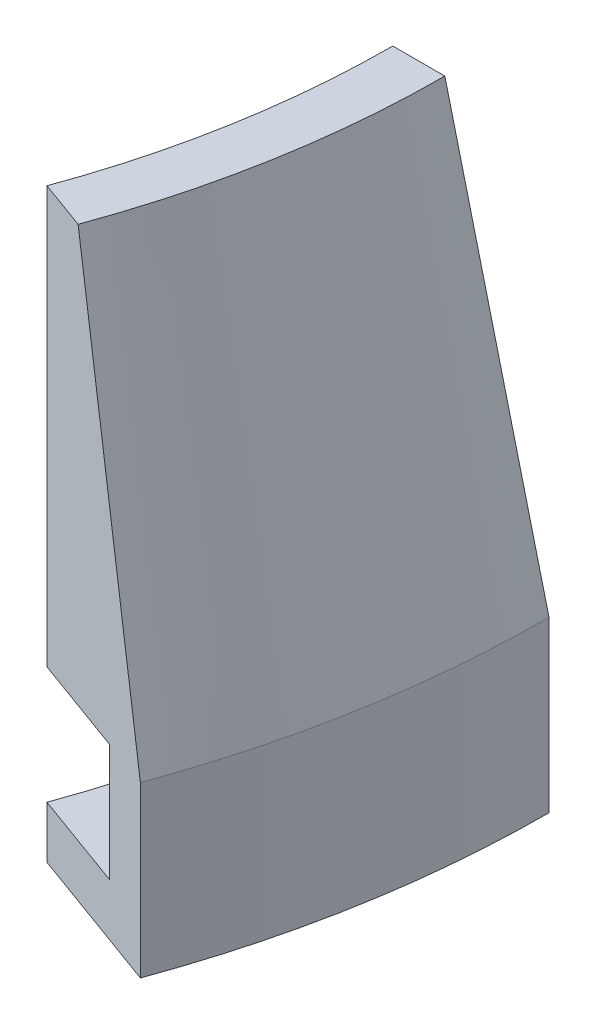
ISO-10303-21;
HEADER;
FILE_DESCRIPTION(('STEP AP214'),'2;1');
FILE_NAME('part.step','',(''),(''),'','','');
FILE_SCHEMA(('AUTOMOTIVE_DESIGN { 1 0 10303 214 1 1 1 1 }'));
ENDSEC;
DATA;
#1=APPLICATION_CONTEXT('core data for automotive mechanical design processes');
#2=APPLICATION_PROTOCOL_DEFINITION('international standard','automotive_design',2000,#1);
#3=PRODUCT_CONTEXT('',#1,'mechanical');
#4=PRODUCT('Part','Part','',(#3));
#5=PRODUCT_RELATED_PRODUCT_CATEGORY('part','',(#4));
#6=PRODUCT_DEFINITION_FORMATION('','',#4);
#7=PRODUCT_DEFINITION_CONTEXT('part definition',#1,'design');
#8=PRODUCT_DEFINITION('design','',#6,#7);
#9=PRODUCT_DEFINITION_SHAPE('','',#8);
#10=(LENGTH_UNIT() NAMED_UNIT(*) SI_UNIT(.MILLI.,.METRE.));
#11=(NAMED_UNIT(*) PLANE_ANGLE_UNIT() SI_UNIT($,.RADIAN.));
#12=(NAMED_UNIT(*) SI_UNIT($,.STERADIAN.) SOLID_ANGLE_UNIT());
#13=UNCERTAINTY_MEASURE_WITH_UNIT(LENGTH_MEASURE(1.E-05),#10,'distance_accuracy_value','');
#14=(GEOMETRIC_REPRESENTATION_CONTEXT(3) GLOBAL_UNCERTAINTY_ASSIGNED_CONTEXT((#13)) GLOBAL_UNIT_ASSIGNED_CONTEXT((#10,
#11,#12)) REPRESENTATION_CONTEXT('',''));
#15=CARTESIAN_POINT('',(0.,0.,0.));
#16=DIRECTION('',(0.,0.,1.));
#17=DIRECTION('',(1.,0.,0.));
#18=AXIS2_PLACEMENT_3D('',#15,#16,#17);
#19=CARTESIAN_POINT('',(-104.775,0.,0.));
#20=DIRECTION('',(0.,-1.,0.));
#21=DIRECTION('',(1.,0.,0.));
#22=AXIS2_PLACEMENT_3D('',#19,#20,#21);
#23=CONICAL_SURFACE('',#22,123.825,0.244978663126864);
#24=CARTESIAN_POINT('',(-104.775,50.7999999999999,0.));
#25=DIRECTION('',(0.,1.,0.));
#26=DIRECTION('',(-1.,0.,0.));
#27=AXIS2_PLACEMENT_3D('',#24,#25,#26);
#28=CIRCLE('',#27,111.125);
#29=CARTESIAN_POINT('',(-0.351657515165962,50.8,38.006988427065));
#30=VERTEX_POINT('',#29);
#31=CARTESIAN_POINT('',(6.35,50.8,0.));
#32=VERTEX_POINT('',#31);
#33=EDGE_CURVE('E11',#30,#32,#28,.T.);
#34=ORIENTED_EDGE('',*,*,#33,.F.);
#35=DIRECTION('',(-0.22790893712434,0.970142500145332,-0.0829520692365073));
#36=VECTOR('',#35,1.);
#37=CARTESIAN_POINT('',(10.5294302731697,4.48235294117647,41.9673804984567));
#38=LINE('',#37,#36);
#39=CARTESIAN_POINT('',(11.5824387688151,0.,42.350644247301));
#40=VERTEX_POINT('',#39);
#41=EDGE_CURVE('E157',#40,#30,#38,.T.);
#42=ORIENTED_EDGE('',*,*,#41,.F.);
#43=CARTESIAN_POINT('',(-104.775,0.,0.));
#44=DIRECTION('',(0.,1.,0.));
#45=DIRECTION('',(-1.,0.,0.));
#46=AXIS2_PLACEMENT_3D('',#43,#44,#45);
#47=CIRCLE('',#46,123.825);
#48=CARTESIAN_POINT('',(19.05,0.,0.));
#49=VERTEX_POINT('',#48);
#50=EDGE_CURVE('E55',#40,#49,#47,.T.);
#51=ORIENTED_EDGE('',*,*,#50,.T.);
#52=DIRECTION('',(-0.242535625036333,0.970142500145332,0.));
#53=VECTOR('',#52,1.);
#54=CARTESIAN_POINT('',(17.9294117647059,4.48235294117647,0.));
#55=LINE('',#54,#53);
#56=EDGE_CURVE('E121',#49,#32,#55,.T.);
#57=ORIENTED_EDGE('',*,*,#56,.T.);
#58=EDGE_LOOP('',(#34,#42,#51,#57));
#59=FACE_BOUND('',#58,.T.);
#60=ADVANCED_FACE('F39',(#59),#23,.T.);
#61=CARTESIAN_POINT('',(-6.31870565715643,50.8,35.835160516947));
#62=DIRECTION('',(0.,-1.,0.));
#63=DIRECTION('',(1.,0.,0.));
#64=AXIS2_PLACEMENT_3D('',#61,#62,#63);
#65=PLANE('',#64);
#66=CARTESIAN_POINT('',(-104.775,50.8,0.));
#67=DIRECTION('',(0.,1.,0.));
#68=DIRECTION('',(-1.,0.,0.));
#69=AXIS2_PLACEMENT_3D('',#66,#67,#68);
#70=CIRCLE('',#69,104.775);
#71=CARTESIAN_POINT('',(-6.31870565715648,50.8,35.835160516947));
#72=VERTEX_POINT('',#71);
#73=CARTESIAN_POINT('',(0.,50.8,0.));
#74=VERTEX_POINT('',#73);
#75=EDGE_CURVE('E48',#72,#74,#70,.T.);
#76=ORIENTED_EDGE('',*,*,#75,.F.);
#77=DIRECTION('',(-0.939692620785908,0.,-0.342020143325669));
#78=VECTOR('',#77,1.);
#79=CARTESIAN_POINT('',(-6.31870565715643,50.8,35.835160516947));
#80=LINE('',#79,#78);
#81=EDGE_CURVE('E117',#30,#72,#80,.T.);
#82=ORIENTED_EDGE('',*,*,#81,.F.);
#83=ORIENTED_EDGE('',*,*,#33,.T.);
#84=DIRECTION('',(-1.,0.,0.));
#85=VECTOR('',#84,1.);
#86=CARTESIAN_POINT('',(0.,50.8,0.));
#87=LINE('',#86,#85);
#88=EDGE_CURVE('E114',#32,#74,#87,.T.);
#89=ORIENTED_EDGE('',*,*,#88,.T.);
#90=EDGE_LOOP('',(#76,#82,#83,#89));
#91=FACE_BOUND('',#90,.T.);
#92=ADVANCED_FACE('F41',(#91),#65,.F.);
#93=CARTESIAN_POINT('',(-104.775,37.305468679812,0.));
#94=DIRECTION('',(0.,1.,0.));
#95=DIRECTION('',(-1.,0.,0.));
#96=AXIS2_PLACEMENT_3D('',#93,#94,#95);
#97=CYLINDRICAL_SURFACE('',#96,104.775);
#98=CARTESIAN_POINT('',(-104.775,0.,0.));
#99=DIRECTION('',(0.,1.,0.));
#100=DIRECTION('',(-1.,0.,0.));
#101=AXIS2_PLACEMENT_3D('',#98,#99,#100);
#102=CIRCLE('',#101,104.775);
#103=CARTESIAN_POINT('',(-6.31870565715648,0.,35.835160516947));
#104=VERTEX_POINT('',#103);
#105=CARTESIAN_POINT('',(0.,0.,0.));
#106=VERTEX_POINT('',#105);
#107=EDGE_CURVE('E205',#104,#106,#102,.T.);
#108=ORIENTED_EDGE('',*,*,#107,.F.);
#109=DIRECTION('',(0.,1.,0.));
#110=VECTOR('',#109,1.);
#111=CARTESIAN_POINT('',(-6.31870565715648,0.,35.835160516947));
#112=LINE('',#111,#110);
#113=EDGE_CURVE('E162',#104,#72,#112,.T.);
#114=ORIENTED_EDGE('',*,*,#113,.T.);
#115=ORIENTED_EDGE('',*,*,#75,.T.);
#116=DIRECTION('',(0.,1.,0.));
#117=VECTOR('',#116,1.);
#118=CARTESIAN_POINT('',(0.,0.,0.));
#119=LINE('',#118,#117);
#120=EDGE_CURVE('E129',#106,#74,#119,.T.);
#121=ORIENTED_EDGE('',*,*,#120,.F.);
#122=EDGE_LOOP('',(#108,#114,#115,#121));
#123=FACE_BOUND('',#122,.T.);
#124=ADVANCED_FACE('F209',(#123),#97,.F.);
#125=CARTESIAN_POINT('',(-6.31870565715648,0.,35.835160516947));
#126=DIRECTION('',(0.,1.,0.));
#127=DIRECTION('',(-1.,0.,0.));
#128=AXIS2_PLACEMENT_3D('',#125,#126,#127);
#129=PLANE('',#128);
#130=CARTESIAN_POINT('',(-104.775,0.,0.));
#131=DIRECTION('',(0.,1.,0.));
#132=DIRECTION('',(-1.,0.,0.));
#133=AXIS2_PLACEMENT_3D('',#130,#131,#132);
#134=CIRCLE('',#133,117.475);
#135=CARTESIAN_POINT('',(5.61539062682455,0.,40.178816337183));
#136=VERTEX_POINT('',#135);
#137=CARTESIAN_POINT('',(12.7,0.,0.));
#138=VERTEX_POINT('',#137);
#139=EDGE_CURVE('E202',#136,#138,#134,.T.);
#140=ORIENTED_EDGE('',*,*,#139,.F.);
#141=DIRECTION('',(0.939692620785908,0.,0.342020143325669));
#142=VECTOR('',#141,1.);
#143=CARTESIAN_POINT('',(-6.31870565715648,0.,35.835160516947));
#144=LINE('',#143,#142);
#145=EDGE_CURVE('E166',#104,#136,#144,.T.);
#146=ORIENTED_EDGE('',*,*,#145,.F.);
#147=ORIENTED_EDGE('',*,*,#107,.T.);
#148=DIRECTION('',(1.,0.,0.));
#149=VECTOR('',#148,1.);
#150=CARTESIAN_POINT('',(0.,0.,0.));
#151=LINE('',#150,#149);
#152=EDGE_CURVE('E133',#106,#138,#151,.T.);
#153=ORIENTED_EDGE('',*,*,#152,.T.);
#154=EDGE_LOOP('',(#140,#146,#147,#153));
#155=FACE_BOUND('',#154,.T.);
#156=ADVANCED_FACE('F230',(#155),#129,.F.);
#157=CARTESIAN_POINT('',(-104.775,37.305468679812,0.));
#158=DIRECTION('',(0.,1.,0.));
#159=DIRECTION('',(-1.,0.,0.));
#160=AXIS2_PLACEMENT_3D('',#157,#158,#159);
#161=CYLINDRICAL_SURFACE('',#160,117.475);
#162=CARTESIAN_POINT('',(-104.775,-14.2875,0.));
#163=DIRECTION('',(0.,1.,0.));
#164=DIRECTION('',(-1.,0.,0.));
#165=AXIS2_PLACEMENT_3D('',#162,#163,#164);
#166=CIRCLE('',#165,117.475);
#167=CARTESIAN_POINT('',(5.61539062682455,-14.2875,40.178816337183));
#168=VERTEX_POINT('',#167);
#169=CARTESIAN_POINT('',(12.7,-14.2875,0.));
#170=VERTEX_POINT('',#169);
#171=EDGE_CURVE('E199',#168,#170,#166,.T.);
#172=ORIENTED_EDGE('',*,*,#171,.F.);
#173=DIRECTION('',(0.,-1.,0.));
#174=VECTOR('',#173,1.);
#175=CARTESIAN_POINT('',(5.61539062682455,0.,40.178816337183));
#176=LINE('',#175,#174);
#177=EDGE_CURVE('E170',#136,#168,#176,.T.);
#178=ORIENTED_EDGE('',*,*,#177,.F.);
#179=ORIENTED_EDGE('',*,*,#139,.T.);
#180=DIRECTION('',(0.,-1.,0.));
#181=VECTOR('',#180,1.);
#182=CARTESIAN_POINT('',(12.7,0.,0.));
#183=LINE('',#182,#181);
#184=EDGE_CURVE('E139',#138,#170,#183,.T.);
#185=ORIENTED_EDGE('',*,*,#184,.T.);
#186=EDGE_LOOP('',(#172,#178,#179,#185));
#187=FACE_BOUND('',#186,.T.);
#188=ADVANCED_FACE('F228',(#187),#161,.F.);
#189=CARTESIAN_POINT('',(-6.31870565715647,-14.2875,35.835160516947));
#190=DIRECTION('',(0.,-1.,0.));
#191=DIRECTION('',(1.,0.,0.));
#192=AXIS2_PLACEMENT_3D('',#189,#190,#191);
#193=PLANE('',#192);
#194=CARTESIAN_POINT('',(-104.775,-14.2875,0.));
#195=DIRECTION('',(0.,1.,0.));
#196=DIRECTION('',(-1.,0.,0.));
#197=AXIS2_PLACEMENT_3D('',#194,#195,#196);
#198=CIRCLE('',#197,104.775);
#199=CARTESIAN_POINT('',(-6.31870565715648,-14.2875,35.835160516947));
#200=VERTEX_POINT('',#199);
#201=CARTESIAN_POINT('',(0.,-14.2875,0.));
#202=VERTEX_POINT('',#201);
#203=EDGE_CURVE('E196',#200,#202,#198,.T.);
#204=ORIENTED_EDGE('',*,*,#203,.F.);
#205=DIRECTION('',(-0.939692620785908,0.,-0.342020143325669));
#206=VECTOR('',#205,1.);
#207=CARTESIAN_POINT('',(-6.31870565715647,-14.2875,35.835160516947));
#208=LINE('',#207,#206);
#209=EDGE_CURVE('E174',#168,#200,#208,.T.);
#210=ORIENTED_EDGE('',*,*,#209,.F.);
#211=ORIENTED_EDGE('',*,*,#171,.T.);
#212=DIRECTION('',(-1.,0.,0.));
#213=VECTOR('',#212,1.);
#214=CARTESIAN_POINT('',(0.,-14.2875,0.));
#215=LINE('',#214,#213);
#216=EDGE_CURVE('E143',#170,#202,#215,.T.);
#217=ORIENTED_EDGE('',*,*,#216,.T.);
#218=EDGE_LOOP('',(#204,#210,#211,#217));
#219=FACE_BOUND('',#218,.T.);
#220=ADVANCED_FACE('F225',(#219),#193,.F.);
#221=CARTESIAN_POINT('',(-104.775,37.305468679812,0.));
#222=DIRECTION('',(0.,1.,0.));
#223=DIRECTION('',(-1.,0.,0.));
#224=AXIS2_PLACEMENT_3D('',#221,#222,#223);
#225=CYLINDRICAL_SURFACE('',#224,104.775);
#226=CARTESIAN_POINT('',(-104.775,-20.6375,0.));
#227=DIRECTION('',(0.,1.,0.));
#228=DIRECTION('',(-1.,0.,0.));
#229=AXIS2_PLACEMENT_3D('',#226,#227,#228);
#230=CIRCLE('',#229,104.775);
#231=CARTESIAN_POINT('',(-6.31870565715647,-20.6375,35.835160516947));
#232=VERTEX_POINT('',#231);
#233=CARTESIAN_POINT('',(0.,-20.6375,0.));
#234=VERTEX_POINT('',#233);
#235=EDGE_CURVE('E193',#232,#234,#230,.T.);
#236=ORIENTED_EDGE('',*,*,#235,.F.);
#237=DIRECTION('',(0.,-1.,0.));
#238=VECTOR('',#237,1.);
#239=CARTESIAN_POINT('',(-6.31870565715648,0.,35.835160516947));
#240=LINE('',#239,#238);
#241=EDGE_CURVE('E178',#200,#232,#240,.T.);
#242=ORIENTED_EDGE('',*,*,#241,.F.);
#243=ORIENTED_EDGE('',*,*,#203,.T.);
#244=DIRECTION('',(0.,-1.,0.));
#245=VECTOR('',#244,1.);
#246=CARTESIAN_POINT('',(0.,0.,0.));
#247=LINE('',#246,#245);
#248=EDGE_CURVE('E147',#202,#234,#247,.T.);
#249=ORIENTED_EDGE('',*,*,#248,.T.);
#250=EDGE_LOOP('',(#236,#242,#243,#249));
#251=FACE_BOUND('',#250,.T.);
#252=ADVANCED_FACE('F221',(#251),#225,.F.);
#253=CARTESIAN_POINT('',(-6.31870565715648,-20.6375,35.835160516947));
#254=DIRECTION('',(0.,1.,0.));
#255=DIRECTION('',(-1.,0.,0.));
#256=AXIS2_PLACEMENT_3D('',#253,#254,#255);
#257=PLANE('',#256);
#258=CARTESIAN_POINT('',(-104.775,-20.6375,0.));
#259=DIRECTION('',(0.,1.,0.));
#260=DIRECTION('',(-1.,0.,0.));
#261=AXIS2_PLACEMENT_3D('',#258,#259,#260);
#262=CIRCLE('',#261,123.825);
#263=CARTESIAN_POINT('',(11.5824387688151,-20.6375,42.350644247301));
#264=VERTEX_POINT('',#263);
#265=CARTESIAN_POINT('',(19.05,-20.6375,0.));
#266=VERTEX_POINT('',#265);
#267=EDGE_CURVE('E63',#264,#266,#262,.T.);
#268=ORIENTED_EDGE('',*,*,#267,.F.);
#269=DIRECTION('',(0.939692620785908,0.,0.342020143325669));
#270=VECTOR('',#269,1.);
#271=CARTESIAN_POINT('',(-6.31870565715648,-20.6375,35.835160516947));
#272=LINE('',#271,#270);
#273=EDGE_CURVE('E182',#232,#264,#272,.T.);
#274=ORIENTED_EDGE('',*,*,#273,.F.);
#275=ORIENTED_EDGE('',*,*,#235,.T.);
#276=DIRECTION('',(1.,0.,0.));
#277=VECTOR('',#276,1.);
#278=CARTESIAN_POINT('',(0.,-20.6375,0.));
#279=LINE('',#278,#277);
#280=EDGE_CURVE('E151',#234,#266,#279,.T.);
#281=ORIENTED_EDGE('',*,*,#280,.T.);
#282=EDGE_LOOP('',(#268,#274,#275,#281));
#283=FACE_BOUND('',#282,.T.);
#284=ADVANCED_FACE('F216',(#283),#257,.F.);
#285=CARTESIAN_POINT('',(-104.775,37.305468679812,0.));
#286=DIRECTION('',(0.,1.,0.));
#287=DIRECTION('',(-1.,0.,0.));
#288=AXIS2_PLACEMENT_3D('',#285,#286,#287);
#289=CYLINDRICAL_SURFACE('',#288,123.825);
#290=DIRECTION('',(0.,1.,0.));
#291=VECTOR('',#290,1.);
#292=CARTESIAN_POINT('',(11.5824387688151,0.,42.350644247301));
#293=LINE('',#292,#291);
#294=EDGE_CURVE('E185',#264,#40,#293,.T.);
#295=ORIENTED_EDGE('',*,*,#294,.F.);
#296=ORIENTED_EDGE('',*,*,#267,.T.);
#297=DIRECTION('',(0.,1.,0.));
#298=VECTOR('',#297,1.);
#299=CARTESIAN_POINT('',(19.05,0.,0.));
#300=LINE('',#299,#298);
#301=EDGE_CURVE('E154',#266,#49,#300,.T.);
#302=ORIENTED_EDGE('',*,*,#301,.T.);
#303=ORIENTED_EDGE('',*,*,#50,.F.);
#304=EDGE_LOOP('',(#295,#296,#302,#303));
#305=FACE_BOUND('',#304,.T.);
#306=ADVANCED_FACE('F214',(#305),#289,.T.);
#307=CARTESIAN_POINT('',(-6.31870565715648,0.,35.835160516947));
#308=DIRECTION('',(-0.342020143325669,0.,0.939692620785908));
#309=DIRECTION('',(0.939692620785908,0.,0.342020143325669));
#310=AXIS2_PLACEMENT_3D('',#307,#308,#309);
#311=PLANE('',#310);
#312=ORIENTED_EDGE('',*,*,#41,.T.);
#313=ORIENTED_EDGE('',*,*,#81,.T.);
#314=ORIENTED_EDGE('',*,*,#113,.F.);
#315=ORIENTED_EDGE('',*,*,#145,.T.);
#316=ORIENTED_EDGE('',*,*,#177,.T.);
#317=ORIENTED_EDGE('',*,*,#209,.T.);
#318=ORIENTED_EDGE('',*,*,#241,.T.);
#319=ORIENTED_EDGE('',*,*,#273,.T.);
#320=ORIENTED_EDGE('',*,*,#294,.T.);
#321=EDGE_LOOP('',(#312,#313,#314,#315,#316,#317,#318,#319,#320));
#322=FACE_BOUND('',#321,.T.);
#323=ADVANCED_FACE('F212',(#322),#311,.T.);
#324=CARTESIAN_POINT('',(0.,0.,0.));
#325=DIRECTION('',(0.,0.,1.));
#326=DIRECTION('',(1.,0.,0.));
#327=AXIS2_PLACEMENT_3D('',#324,#325,#326);
#328=PLANE('',#327);
#329=ORIENTED_EDGE('',*,*,#56,.F.);
#330=ORIENTED_EDGE('',*,*,#301,.F.);
#331=ORIENTED_EDGE('',*,*,#280,.F.);
#332=ORIENTED_EDGE('',*,*,#248,.F.);
#333=ORIENTED_EDGE('',*,*,#216,.F.);
#334=ORIENTED_EDGE('',*,*,#184,.F.);
#335=ORIENTED_EDGE('',*,*,#152,.F.);
#336=ORIENTED_EDGE('',*,*,#120,.T.);
#337=ORIENTED_EDGE('',*,*,#88,.F.);
#338=EDGE_LOOP('',(#329,#330,#331,#332,#333,#334,#335,#336,#337));
#339=FACE_BOUND('',#338,.T.);
#340=ADVANCED_FACE('F126',(#339),#328,.F.);
#341=CLOSED_SHELL('',(#60,#92,#124,#156,#188,#220,#252,#284,#306,#323,#340));
#342=MANIFOLD_SOLID_BREP('B2',#341);
#343=ADVANCED_BREP_SHAPE_REPRESENTATION('',(#18,#342),#14);
#344=SHAPE_DEFINITION_REPRESENTATION(#9,#343);
ENDSEC;
END-ISO-10303-21;
